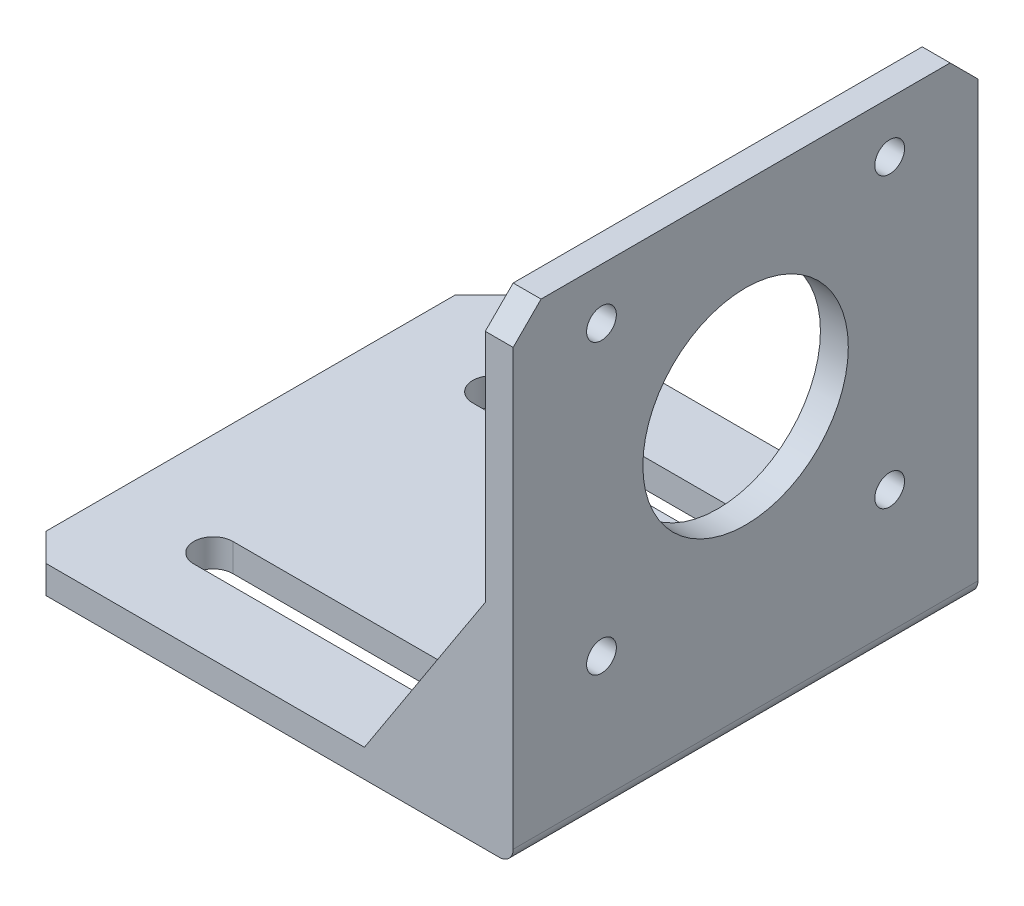
ISO-10303-21;
HEADER;
FILE_DESCRIPTION(('STEP AP214'),'2;1');
FILE_NAME('part.step','',(''),(''),'','','');
FILE_SCHEMA(('AUTOMOTIVE_DESIGN { 1 0 10303 214 1 1 1 1 }'));
ENDSEC;
DATA;
#1=APPLICATION_CONTEXT('core data for automotive mechanical design processes');
#2=APPLICATION_PROTOCOL_DEFINITION('international standard','automotive_design',2000,#1);
#3=PRODUCT_CONTEXT('',#1,'mechanical');
#4=PRODUCT('Part','Part','',(#3));
#5=PRODUCT_RELATED_PRODUCT_CATEGORY('part','',(#4));
#6=PRODUCT_DEFINITION_FORMATION('','',#4);
#7=PRODUCT_DEFINITION_CONTEXT('part definition',#1,'design');
#8=PRODUCT_DEFINITION('design','',#6,#7);
#9=PRODUCT_DEFINITION_SHAPE('','',#8);
#10=(LENGTH_UNIT() NAMED_UNIT(*) SI_UNIT(.MILLI.,.METRE.));
#11=(NAMED_UNIT(*) PLANE_ANGLE_UNIT() SI_UNIT($,.RADIAN.));
#12=(NAMED_UNIT(*) SI_UNIT($,.STERADIAN.) SOLID_ANGLE_UNIT());
#13=UNCERTAINTY_MEASURE_WITH_UNIT(LENGTH_MEASURE(1.E-05),#10,'distance_accuracy_value','');
#14=(GEOMETRIC_REPRESENTATION_CONTEXT(3) GLOBAL_UNCERTAINTY_ASSIGNED_CONTEXT((#13)) GLOBAL_UNIT_ASSIGNED_CONTEXT((#10,
#11,#12)) REPRESENTATION_CONTEXT('',''));
#15=CARTESIAN_POINT('',(0.,0.,0.));
#16=DIRECTION('',(0.,0.,1.));
#17=DIRECTION('',(1.,0.,0.));
#18=AXIS2_PLACEMENT_3D('',#15,#16,#17);
#19=CARTESIAN_POINT('',(0.,-3.,50.));
#20=DIRECTION('',(1.,0.,0.));
#21=DIRECTION('',(0.,0.,-1.));
#22=AXIS2_PLACEMENT_3D('',#19,#20,#21);
#23=PLANE('',#22);
#24=DIRECTION('',(0.,0.,-1.));
#25=VECTOR('',#24,1.);
#26=CARTESIAN_POINT('',(0.,0.,50.));
#27=LINE('',#26,#25);
#28=CARTESIAN_POINT('',(0.,0.,47.));
#29=VERTEX_POINT('',#28);
#30=CARTESIAN_POINT('',(0.,0.,3.00000000000002));
#31=VERTEX_POINT('',#30);
#32=EDGE_CURVE('E455',#29,#31,#27,.T.);
#33=ORIENTED_EDGE('',*,*,#32,.T.);
#34=DIRECTION('',(0.,-1.,0.));
#35=VECTOR('',#34,1.);
#36=CARTESIAN_POINT('',(0.,-3.,3.00000000000002));
#37=LINE('',#36,#35);
#38=CARTESIAN_POINT('',(0.,-3.,3.00000000000002));
#39=VERTEX_POINT('',#38);
#40=EDGE_CURVE('E505',#31,#39,#37,.T.);
#41=ORIENTED_EDGE('',*,*,#40,.T.);
#42=DIRECTION('',(0.,0.,-1.));
#43=VECTOR('',#42,1.);
#44=CARTESIAN_POINT('',(0.,-3.,50.));
#45=LINE('',#44,#43);
#46=CARTESIAN_POINT('',(0.,-3.,47.));
#47=VERTEX_POINT('',#46);
#48=EDGE_CURVE('E472',#47,#39,#45,.T.);
#49=ORIENTED_EDGE('',*,*,#48,.F.);
#50=DIRECTION('',(0.,1.,0.));
#51=VECTOR('',#50,1.);
#52=CARTESIAN_POINT('',(0.,-3.,47.));
#53=LINE('',#52,#51);
#54=EDGE_CURVE('E503',#47,#29,#53,.T.);
#55=ORIENTED_EDGE('',*,*,#54,.T.);
#56=EDGE_LOOP('',(#33,#41,#49,#55));
#57=FACE_BOUND('',#56,.T.);
#58=ADVANCED_FACE('F189',(#57),#23,.F.);
#59=CARTESIAN_POINT('',(53.25,-2.99999999999999,50.));
#60=DIRECTION('',(0.,1.,0.));
#61=DIRECTION('',(-1.,0.,0.));
#62=AXIS2_PLACEMENT_3D('',#59,#60,#61);
#63=PLANE('',#62);
#64=DIRECTION('',(1.,0.,0.));
#65=VECTOR('',#64,1.);
#66=CARTESIAN_POINT('',(53.25,-2.99999999999999,0.));
#67=LINE('',#66,#65);
#68=CARTESIAN_POINT('',(3.00000000000002,-3.,0.));
#69=VERTEX_POINT('',#68);
#70=CARTESIAN_POINT('',(51.75,-2.99999999999999,0.));
#71=VERTEX_POINT('',#70);
#72=EDGE_CURVE('E449',#69,#71,#67,.T.);
#73=ORIENTED_EDGE('',*,*,#72,.T.);
#74=DIRECTION('',(0.,0.,-1.));
#75=VECTOR('',#74,1.);
#76=CARTESIAN_POINT('',(51.75,-2.99999999999999,50.));
#77=LINE('',#76,#75);
#78=CARTESIAN_POINT('',(51.75,-2.99999999999999,50.));
#79=VERTEX_POINT('',#78);
#80=EDGE_CURVE('E544',#71,#79,#77,.F.);
#81=ORIENTED_EDGE('',*,*,#80,.T.);
#82=DIRECTION('',(1.,0.,0.));
#83=VECTOR('',#82,1.);
#84=CARTESIAN_POINT('',(53.25,-2.99999999999999,50.));
#85=LINE('',#84,#83);
#86=CARTESIAN_POINT('',(3.00000000000002,-3.,50.));
#87=VERTEX_POINT('',#86);
#88=EDGE_CURVE('E450',#87,#79,#85,.T.);
#89=ORIENTED_EDGE('',*,*,#88,.F.);
#90=DIRECTION('',(0.707106781186548,0.,0.707106781186548));
#91=VECTOR('',#90,1.);
#92=CARTESIAN_POINT('',(3.00000000000002,-3.,50.));
#93=LINE('',#92,#91);
#94=EDGE_CURVE('E508',#87,#47,#93,.F.);
#95=ORIENTED_EDGE('',*,*,#94,.T.);
#96=ORIENTED_EDGE('',*,*,#48,.T.);
#97=DIRECTION('',(0.707106781186548,0.,-0.707106781186548));
#98=VECTOR('',#97,1.);
#99=CARTESIAN_POINT('',(0.,-3.,3.00000000000002));
#100=LINE('',#99,#98);
#101=EDGE_CURVE('E510',#39,#69,#100,.T.);
#102=ORIENTED_EDGE('',*,*,#101,.T.);
#103=EDGE_LOOP('',(#73,#81,#89,#95,#96,#102));
#104=FACE_BOUND('',#103,.T.);
#105=CARTESIAN_POINT('',(41.,-2.99999999999999,10.));
#106=DIRECTION('',(0.,1.,0.));
#107=DIRECTION('',(-1.,0.,0.));
#108=AXIS2_PLACEMENT_3D('',#105,#106,#107);
#109=CIRCLE('',#108,2.1);
#110=CARTESIAN_POINT('',(41.,-2.99999999999999,12.1));
#111=VERTEX_POINT('',#110);
#112=CARTESIAN_POINT('',(41.,-3.,7.9));
#113=VERTEX_POINT('',#112);
#114=EDGE_CURVE('E493',#111,#113,#109,.T.);
#115=ORIENTED_EDGE('',*,*,#114,.T.);
#116=DIRECTION('',(-1.,0.,0.));
#117=VECTOR('',#116,1.);
#118=CARTESIAN_POINT('',(53.25,-2.99999999999999,7.9));
#119=LINE('',#118,#117);
#120=CARTESIAN_POINT('',(11.,-3.,7.9));
#121=VERTEX_POINT('',#120);
#122=EDGE_CURVE('E496',#113,#121,#119,.T.);
#123=ORIENTED_EDGE('',*,*,#122,.T.);
#124=CARTESIAN_POINT('',(11.,-3.,10.));
#125=DIRECTION('',(0.,1.,0.));
#126=DIRECTION('',(-1.,0.,0.));
#127=AXIS2_PLACEMENT_3D('',#124,#125,#126);
#128=CIRCLE('',#127,2.1);
#129=CARTESIAN_POINT('',(11.,-3.,12.1));
#130=VERTEX_POINT('',#129);
#131=EDGE_CURVE('E490',#121,#130,#128,.T.);
#132=ORIENTED_EDGE('',*,*,#131,.T.);
#133=DIRECTION('',(1.,0.,0.));
#134=VECTOR('',#133,1.);
#135=CARTESIAN_POINT('',(53.25,-2.99999999999999,12.1));
#136=LINE('',#135,#134);
#137=EDGE_CURVE('E487',#130,#111,#136,.T.);
#138=ORIENTED_EDGE('',*,*,#137,.T.);
#139=EDGE_LOOP('',(#115,#123,#132,#138));
#140=FACE_BOUND('',#139,.T.);
#141=CARTESIAN_POINT('',(41.,-2.99999999999999,40.));
#142=DIRECTION('',(0.,1.,0.));
#143=DIRECTION('',(-1.,0.,0.));
#144=AXIS2_PLACEMENT_3D('',#141,#142,#143);
#145=CIRCLE('',#144,2.1);
#146=CARTESIAN_POINT('',(41.,-3.,42.1));
#147=VERTEX_POINT('',#146);
#148=CARTESIAN_POINT('',(41.,-3.,37.9));
#149=VERTEX_POINT('',#148);
#150=EDGE_CURVE('E481',#147,#149,#145,.T.);
#151=ORIENTED_EDGE('',*,*,#150,.T.);
#152=DIRECTION('',(-1.,0.,0.));
#153=VECTOR('',#152,1.);
#154=CARTESIAN_POINT('',(53.25,-2.99999999999999,37.9));
#155=LINE('',#154,#153);
#156=CARTESIAN_POINT('',(11.,-3.,37.9));
#157=VERTEX_POINT('',#156);
#158=EDGE_CURVE('E484',#149,#157,#155,.T.);
#159=ORIENTED_EDGE('',*,*,#158,.T.);
#160=CARTESIAN_POINT('',(11.,-3.,40.));
#161=DIRECTION('',(0.,1.,0.));
#162=DIRECTION('',(-1.,0.,0.));
#163=AXIS2_PLACEMENT_3D('',#160,#161,#162);
#164=CIRCLE('',#163,2.1);
#165=CARTESIAN_POINT('',(11.,-3.,42.1));
#166=VERTEX_POINT('',#165);
#167=EDGE_CURVE('E478',#157,#166,#164,.T.);
#168=ORIENTED_EDGE('',*,*,#167,.T.);
#169=DIRECTION('',(1.,0.,0.));
#170=VECTOR('',#169,1.);
#171=CARTESIAN_POINT('',(53.25,-2.99999999999999,42.1));
#172=LINE('',#171,#170);
#173=EDGE_CURVE('E475',#166,#147,#172,.T.);
#174=ORIENTED_EDGE('',*,*,#173,.T.);
#175=EDGE_LOOP('',(#151,#159,#168,#174));
#176=FACE_BOUND('',#175,.T.);
#177=ADVANCED_FACE('F585',(#104,#140,#176),#63,.F.);
#178=CARTESIAN_POINT('',(53.25,48.25,50.));
#179=DIRECTION('',(-1.,0.,0.));
#180=DIRECTION('',(0.,-1.,0.));
#181=AXIS2_PLACEMENT_3D('',#178,#179,#180);
#182=PLANE('',#181);
#183=DIRECTION('',(0.,1.,0.));
#184=VECTOR('',#183,1.);
#185=CARTESIAN_POINT('',(53.25,48.25,50.));
#186=LINE('',#185,#184);
#187=CARTESIAN_POINT('',(53.25,-1.49999999999998,50.));
#188=VERTEX_POINT('',#187);
#189=CARTESIAN_POINT('',(53.25,45.25,50.));
#190=VERTEX_POINT('',#189);
#191=EDGE_CURVE('E360',#188,#190,#186,.T.);
#192=ORIENTED_EDGE('',*,*,#191,.F.);
#193=DIRECTION('',(0.,0.,-1.));
#194=VECTOR('',#193,1.);
#195=CARTESIAN_POINT('',(53.25,-1.49999999999999,50.));
#196=LINE('',#195,#194);
#197=CARTESIAN_POINT('',(53.25,-1.49999999999998,0.));
#198=VERTEX_POINT('',#197);
#199=EDGE_CURVE('E539',#188,#198,#196,.T.);
#200=ORIENTED_EDGE('',*,*,#199,.T.);
#201=DIRECTION('',(0.,1.,0.));
#202=VECTOR('',#201,1.);
#203=CARTESIAN_POINT('',(53.25,48.25,0.));
#204=LINE('',#203,#202);
#205=CARTESIAN_POINT('',(53.25,45.25,0.));
#206=VERTEX_POINT('',#205);
#207=EDGE_CURVE('E458',#198,#206,#204,.T.);
#208=ORIENTED_EDGE('',*,*,#207,.T.);
#209=DIRECTION('',(0.,0.707106781186548,0.707106781186548));
#210=VECTOR('',#209,1.);
#211=CARTESIAN_POINT('',(53.25,48.25,3.00000000000002));
#212=LINE('',#211,#210);
#213=CARTESIAN_POINT('',(53.25,48.25,3.00000000000002));
#214=VERTEX_POINT('',#213);
#215=EDGE_CURVE('E537',#206,#214,#212,.T.);
#216=ORIENTED_EDGE('',*,*,#215,.T.);
#217=DIRECTION('',(0.,0.,-1.));
#218=VECTOR('',#217,1.);
#219=CARTESIAN_POINT('',(53.25,48.25,50.));
#220=LINE('',#219,#218);
#221=CARTESIAN_POINT('',(53.25,48.25,47.));
#222=VERTEX_POINT('',#221);
#223=EDGE_CURVE('E469',#222,#214,#220,.T.);
#224=ORIENTED_EDGE('',*,*,#223,.F.);
#225=DIRECTION('',(0.,0.707106781186546,-0.707106781186549));
#226=VECTOR('',#225,1.);
#227=CARTESIAN_POINT('',(53.25,45.25,50.));
#228=LINE('',#227,#226);
#229=EDGE_CURVE('E534',#222,#190,#228,.F.);
#230=ORIENTED_EDGE('',*,*,#229,.T.);
#231=EDGE_LOOP('',(#192,#200,#208,#216,#224,#230));
#232=FACE_BOUND('',#231,.T.);
#233=CARTESIAN_POINT('',(53.25,42.75,9.5));
#234=DIRECTION('',(-1.,0.,0.));
#235=DIRECTION('',(0.,-1.,0.));
#236=AXIS2_PLACEMENT_3D('',#233,#234,#235);
#237=CIRCLE('',#236,1.60000000000001);
#238=CARTESIAN_POINT('',(53.25,41.15,9.5));
#239=VERTEX_POINT('',#238);
#240=EDGE_CURVE('E422',#239,#239,#237,.T.);
#241=ORIENTED_EDGE('',*,*,#240,.T.);
#242=EDGE_LOOP('',(#241));
#243=FACE_BOUND('',#242,.T.);
#244=CARTESIAN_POINT('',(53.25,42.75,40.5));
#245=DIRECTION('',(-1.,0.,0.));
#246=DIRECTION('',(0.,-1.,0.));
#247=AXIS2_PLACEMENT_3D('',#244,#245,#246);
#248=CIRCLE('',#247,1.60000000000001);
#249=CARTESIAN_POINT('',(53.25,41.15,40.5));
#250=VERTEX_POINT('',#249);
#251=EDGE_CURVE('E428',#250,#250,#248,.T.);
#252=ORIENTED_EDGE('',*,*,#251,.T.);
#253=EDGE_LOOP('',(#252));
#254=FACE_BOUND('',#253,.T.);
#255=CARTESIAN_POINT('',(53.25,11.75,40.5));
#256=DIRECTION('',(-1.,0.,0.));
#257=DIRECTION('',(0.,-1.,0.));
#258=AXIS2_PLACEMENT_3D('',#255,#256,#257);
#259=CIRCLE('',#258,1.60000000000001);
#260=CARTESIAN_POINT('',(53.25,10.15,40.5));
#261=VERTEX_POINT('',#260);
#262=EDGE_CURVE('E434',#261,#261,#259,.T.);
#263=ORIENTED_EDGE('',*,*,#262,.T.);
#264=EDGE_LOOP('',(#263));
#265=FACE_BOUND('',#264,.T.);
#266=CARTESIAN_POINT('',(53.25,11.75,9.50000000000001));
#267=DIRECTION('',(-1.,0.,0.));
#268=DIRECTION('',(0.,-1.,0.));
#269=AXIS2_PLACEMENT_3D('',#266,#267,#268);
#270=CIRCLE('',#269,1.60000000000001);
#271=CARTESIAN_POINT('',(53.25,10.15,9.50000000000001));
#272=VERTEX_POINT('',#271);
#273=EDGE_CURVE('E440',#272,#272,#270,.T.);
#274=ORIENTED_EDGE('',*,*,#273,.T.);
#275=EDGE_LOOP('',(#274));
#276=FACE_BOUND('',#275,.T.);
#277=CARTESIAN_POINT('',(53.25,27.25,25.));
#278=DIRECTION('',(-1.,0.,0.));
#279=DIRECTION('',(0.,-1.,0.));
#280=AXIS2_PLACEMENT_3D('',#277,#278,#279);
#281=CIRCLE('',#280,11.05);
#282=CARTESIAN_POINT('',(53.25,16.2,25.));
#283=VERTEX_POINT('',#282);
#284=EDGE_CURVE('E446',#283,#283,#281,.T.);
#285=ORIENTED_EDGE('',*,*,#284,.T.);
#286=EDGE_LOOP('',(#285));
#287=FACE_BOUND('',#286,.T.);
#288=ADVANCED_FACE('F605',(#232,#243,#254,#265,#276,#287),#182,.F.);
#289=CARTESIAN_POINT('',(50.25,48.25,50.));
#290=DIRECTION('',(0.,-1.,0.));
#291=DIRECTION('',(0.,0.,-1.));
#292=AXIS2_PLACEMENT_3D('',#289,#290,#291);
#293=PLANE('',#292);
#294=ORIENTED_EDGE('',*,*,#223,.T.);
#295=DIRECTION('',(-1.,0.,0.));
#296=VECTOR('',#295,1.);
#297=CARTESIAN_POINT('',(50.25,48.25,3.00000000000002));
#298=LINE('',#297,#296);
#299=CARTESIAN_POINT('',(50.25,48.25,3.00000000000002));
#300=VERTEX_POINT('',#299);
#301=EDGE_CURVE('E527',#214,#300,#298,.T.);
#302=ORIENTED_EDGE('',*,*,#301,.T.);
#303=DIRECTION('',(0.,0.,-1.));
#304=VECTOR('',#303,1.);
#305=CARTESIAN_POINT('',(50.25,48.25,50.));
#306=LINE('',#305,#304);
#307=CARTESIAN_POINT('',(50.25,48.25,47.));
#308=VERTEX_POINT('',#307);
#309=EDGE_CURVE('E466',#308,#300,#306,.T.);
#310=ORIENTED_EDGE('',*,*,#309,.F.);
#311=DIRECTION('',(1.,0.,0.));
#312=VECTOR('',#311,1.);
#313=CARTESIAN_POINT('',(50.25,48.25,47.));
#314=LINE('',#313,#312);
#315=EDGE_CURVE('E525',#308,#222,#314,.T.);
#316=ORIENTED_EDGE('',*,*,#315,.T.);
#317=EDGE_LOOP('',(#294,#302,#310,#316));
#318=FACE_BOUND('',#317,.T.);
#319=ADVANCED_FACE('F614',(#318),#293,.F.);
#320=CARTESIAN_POINT('',(50.25,0.,50.));
#321=DIRECTION('',(1.,0.,0.));
#322=DIRECTION('',(0.,0.,-1.));
#323=AXIS2_PLACEMENT_3D('',#320,#321,#322);
#324=PLANE('',#323);
#325=CARTESIAN_POINT('',(50.25,42.75,9.5));
#326=DIRECTION('',(-1.,0.,0.));
#327=DIRECTION('',(0.,0.,1.));
#328=AXIS2_PLACEMENT_3D('',#325,#326,#327);
#329=CIRCLE('',#328,1.60000000000002);
#330=CARTESIAN_POINT('',(50.25,42.75,11.1));
#331=VERTEX_POINT('',#330);
#332=EDGE_CURVE('E419',#331,#331,#329,.T.);
#333=ORIENTED_EDGE('',*,*,#332,.F.);
#334=EDGE_LOOP('',(#333));
#335=FACE_BOUND('',#334,.T.);
#336=CARTESIAN_POINT('',(50.25,42.75,40.5));
#337=DIRECTION('',(-1.,0.,0.));
#338=DIRECTION('',(0.,0.,1.));
#339=AXIS2_PLACEMENT_3D('',#336,#337,#338);
#340=CIRCLE('',#339,1.60000000000002);
#341=CARTESIAN_POINT('',(50.25,42.75,42.1));
#342=VERTEX_POINT('',#341);
#343=EDGE_CURVE('E425',#342,#342,#340,.T.);
#344=ORIENTED_EDGE('',*,*,#343,.F.);
#345=EDGE_LOOP('',(#344));
#346=FACE_BOUND('',#345,.T.);
#347=CARTESIAN_POINT('',(50.25,11.75,40.5));
#348=DIRECTION('',(-1.,0.,0.));
#349=DIRECTION('',(0.,0.,1.));
#350=AXIS2_PLACEMENT_3D('',#347,#348,#349);
#351=CIRCLE('',#350,1.60000000000001);
#352=CARTESIAN_POINT('',(50.25,11.75,42.1));
#353=VERTEX_POINT('',#352);
#354=EDGE_CURVE('E431',#353,#353,#351,.T.);
#355=ORIENTED_EDGE('',*,*,#354,.F.);
#356=EDGE_LOOP('',(#355));
#357=FACE_BOUND('',#356,.T.);
#358=CARTESIAN_POINT('',(50.25,11.75,9.50000000000001));
#359=DIRECTION('',(-1.,0.,0.));
#360=DIRECTION('',(0.,0.,1.));
#361=AXIS2_PLACEMENT_3D('',#358,#359,#360);
#362=CIRCLE('',#361,1.60000000000001);
#363=CARTESIAN_POINT('',(50.25,11.75,11.1));
#364=VERTEX_POINT('',#363);
#365=EDGE_CURVE('E437',#364,#364,#362,.T.);
#366=ORIENTED_EDGE('',*,*,#365,.F.);
#367=EDGE_LOOP('',(#366));
#368=FACE_BOUND('',#367,.T.);
#369=CARTESIAN_POINT('',(50.25,27.25,25.));
#370=DIRECTION('',(-1.,0.,0.));
#371=DIRECTION('',(0.,0.,1.));
#372=AXIS2_PLACEMENT_3D('',#369,#370,#371);
#373=CIRCLE('',#372,11.05);
#374=CARTESIAN_POINT('',(50.25,27.25,36.05));
#375=VERTEX_POINT('',#374);
#376=EDGE_CURVE('E443',#375,#375,#373,.T.);
#377=ORIENTED_EDGE('',*,*,#376,.F.);
#378=EDGE_LOOP('',(#377));
#379=FACE_BOUND('',#378,.T.);
#380=DIRECTION('',(0.,1.,0.));
#381=VECTOR('',#380,1.);
#382=CARTESIAN_POINT('',(50.25,0.,2.1));
#383=LINE('',#382,#381);
#384=CARTESIAN_POINT('',(50.25,1.5,2.1));
#385=VERTEX_POINT('',#384);
#386=CARTESIAN_POINT('',(50.25,20.,2.1));
#387=VERTEX_POINT('',#386);
#388=EDGE_CURVE('E562',#385,#387,#383,.T.);
#389=ORIENTED_EDGE('',*,*,#388,.F.);
#390=DIRECTION('',(0.,0.,-1.));
#391=VECTOR('',#390,1.);
#392=CARTESIAN_POINT('',(50.25,1.5,47.9));
#393=LINE('',#392,#391);
#394=CARTESIAN_POINT('',(50.25,1.5,47.9));
#395=VERTEX_POINT('',#394);
#396=EDGE_CURVE('E197',#385,#395,#393,.F.);
#397=ORIENTED_EDGE('',*,*,#396,.T.);
#398=DIRECTION('',(0.,-1.,0.));
#399=VECTOR('',#398,1.);
#400=CARTESIAN_POINT('',(50.25,0.,47.9));
#401=LINE('',#400,#399);
#402=CARTESIAN_POINT('',(50.25,20.,47.9));
#403=VERTEX_POINT('',#402);
#404=EDGE_CURVE('E373',#403,#395,#401,.T.);
#405=ORIENTED_EDGE('',*,*,#404,.F.);
#406=DIRECTION('',(0.,0.,1.));
#407=VECTOR('',#406,1.);
#408=CARTESIAN_POINT('',(50.25,20.,50.));
#409=LINE('',#408,#407);
#410=CARTESIAN_POINT('',(50.25,20.,50.));
#411=VERTEX_POINT('',#410);
#412=EDGE_CURVE('E365',#403,#411,#409,.T.);
#413=ORIENTED_EDGE('',*,*,#412,.T.);
#414=DIRECTION('',(0.,-1.,0.));
#415=VECTOR('',#414,1.);
#416=CARTESIAN_POINT('',(50.25,0.,50.));
#417=LINE('',#416,#415);
#418=CARTESIAN_POINT('',(50.25,45.25,50.));
#419=VERTEX_POINT('',#418);
#420=EDGE_CURVE('E349',#419,#411,#417,.T.);
#421=ORIENTED_EDGE('',*,*,#420,.F.);
#422=DIRECTION('',(0.,-0.707106781186546,0.707106781186549));
#423=VECTOR('',#422,1.);
#424=CARTESIAN_POINT('',(50.25,45.25,50.));
#425=LINE('',#424,#423);
#426=EDGE_CURVE('E530',#419,#308,#425,.F.);
#427=ORIENTED_EDGE('',*,*,#426,.T.);
#428=ORIENTED_EDGE('',*,*,#309,.T.);
#429=DIRECTION('',(0.,-0.707106781186548,-0.707106781186548));
#430=VECTOR('',#429,1.);
#431=CARTESIAN_POINT('',(50.25,48.25,3.00000000000002));
#432=LINE('',#431,#430);
#433=CARTESIAN_POINT('',(50.25,45.25,0.));
#434=VERTEX_POINT('',#433);
#435=EDGE_CURVE('E532',#300,#434,#432,.T.);
#436=ORIENTED_EDGE('',*,*,#435,.T.);
#437=DIRECTION('',(0.,-1.,0.));
#438=VECTOR('',#437,1.);
#439=CARTESIAN_POINT('',(50.25,0.,0.));
#440=LINE('',#439,#438);
#441=CARTESIAN_POINT('',(50.25,20.,0.));
#442=VERTEX_POINT('',#441);
#443=EDGE_CURVE('E460',#434,#442,#440,.T.);
#444=ORIENTED_EDGE('',*,*,#443,.T.);
#445=DIRECTION('',(0.,0.,-1.));
#446=VECTOR('',#445,1.);
#447=CARTESIAN_POINT('',(50.25,20.,50.));
#448=LINE('',#447,#446);
#449=EDGE_CURVE('E573',#442,#387,#448,.F.);
#450=ORIENTED_EDGE('',*,*,#449,.T.);
#451=EDGE_LOOP('',(#389,#397,#405,#413,#421,#427,#428,#436,#444,#450));
#452=FACE_BOUND('',#451,.T.);
#453=ADVANCED_FACE('F372',(#335,#346,#357,#368,#379,#452),#324,.F.);
#454=CARTESIAN_POINT('',(0.,0.,50.));
#455=DIRECTION('',(0.,-1.,0.));
#456=DIRECTION('',(0.,0.,-1.));
#457=AXIS2_PLACEMENT_3D('',#454,#455,#456);
#458=PLANE('',#457);
#459=CARTESIAN_POINT('',(41.,0.,10.));
#460=DIRECTION('',(0.,1.,0.));
#461=DIRECTION('',(0.,0.,1.));
#462=AXIS2_PLACEMENT_3D('',#459,#460,#461);
#463=CIRCLE('',#462,2.1);
#464=CARTESIAN_POINT('',(41.,0.,12.1));
#465=VERTEX_POINT('',#464);
#466=CARTESIAN_POINT('',(41.,0.,7.9));
#467=VERTEX_POINT('',#466);
#468=EDGE_CURVE('E392',#465,#467,#463,.T.);
#469=ORIENTED_EDGE('',*,*,#468,.F.);
#470=DIRECTION('',(1.,0.,0.));
#471=VECTOR('',#470,1.);
#472=CARTESIAN_POINT('',(11.,0.,12.1));
#473=LINE('',#472,#471);
#474=CARTESIAN_POINT('',(11.,0.,12.1));
#475=VERTEX_POINT('',#474);
#476=EDGE_CURVE('E375',#475,#465,#473,.T.);
#477=ORIENTED_EDGE('',*,*,#476,.F.);
#478=CARTESIAN_POINT('',(11.,0.,10.));
#479=DIRECTION('',(0.,1.,0.));
#480=DIRECTION('',(0.,0.,1.));
#481=AXIS2_PLACEMENT_3D('',#478,#479,#480);
#482=CIRCLE('',#481,2.1);
#483=CARTESIAN_POINT('',(11.,0.,7.9));
#484=VERTEX_POINT('',#483);
#485=EDGE_CURVE('E384',#484,#475,#482,.T.);
#486=ORIENTED_EDGE('',*,*,#485,.F.);
#487=DIRECTION('',(1.,0.,0.));
#488=VECTOR('',#487,1.);
#489=CARTESIAN_POINT('',(11.,0.,7.9));
#490=LINE('',#489,#488);
#491=EDGE_CURVE('E381',#484,#467,#490,.T.);
#492=ORIENTED_EDGE('',*,*,#491,.T.);
#493=EDGE_LOOP('',(#469,#477,#486,#492));
#494=FACE_BOUND('',#493,.T.);
#495=CARTESIAN_POINT('',(41.,0.,40.));
#496=DIRECTION('',(0.,1.,0.));
#497=DIRECTION('',(0.,0.,1.));
#498=AXIS2_PLACEMENT_3D('',#495,#496,#497);
#499=CIRCLE('',#498,2.1);
#500=CARTESIAN_POINT('',(41.,0.,42.1));
#501=VERTEX_POINT('',#500);
#502=CARTESIAN_POINT('',(41.,0.,37.9));
#503=VERTEX_POINT('',#502);
#504=EDGE_CURVE('E411',#501,#503,#499,.T.);
#505=ORIENTED_EDGE('',*,*,#504,.F.);
#506=DIRECTION('',(1.,0.,0.));
#507=VECTOR('',#506,1.);
#508=CARTESIAN_POINT('',(11.,0.,42.1));
#509=LINE('',#508,#507);
#510=CARTESIAN_POINT('',(11.,0.,42.1));
#511=VERTEX_POINT('',#510);
#512=EDGE_CURVE('E399',#511,#501,#509,.T.);
#513=ORIENTED_EDGE('',*,*,#512,.F.);
#514=CARTESIAN_POINT('',(11.,0.,40.));
#515=DIRECTION('',(0.,1.,0.));
#516=DIRECTION('',(0.,0.,1.));
#517=AXIS2_PLACEMENT_3D('',#514,#515,#516);
#518=CIRCLE('',#517,2.1);
#519=CARTESIAN_POINT('',(11.,0.,37.9));
#520=VERTEX_POINT('',#519);
#521=EDGE_CURVE('E404',#520,#511,#518,.T.);
#522=ORIENTED_EDGE('',*,*,#521,.F.);
#523=DIRECTION('',(1.,0.,0.));
#524=VECTOR('',#523,1.);
#525=CARTESIAN_POINT('',(11.,0.,37.9));
#526=LINE('',#525,#524);
#527=EDGE_CURVE('E401',#520,#503,#526,.T.);
#528=ORIENTED_EDGE('',*,*,#527,.T.);
#529=EDGE_LOOP('',(#505,#513,#522,#528));
#530=FACE_BOUND('',#529,.T.);
#531=DIRECTION('',(-1.,0.,0.));
#532=VECTOR('',#531,1.);
#533=CARTESIAN_POINT('',(0.,0.,47.9));
#534=LINE('',#533,#532);
#535=CARTESIAN_POINT('',(48.75,0.,47.9));
#536=VERTEX_POINT('',#535);
#537=CARTESIAN_POINT('',(37.25,0.,47.9));
#538=VERTEX_POINT('',#537);
#539=EDGE_CURVE('E499',#536,#538,#534,.T.);
#540=ORIENTED_EDGE('',*,*,#539,.F.);
#541=DIRECTION('',(0.,0.,-1.));
#542=VECTOR('',#541,1.);
#543=CARTESIAN_POINT('',(48.75,0.,2.1));
#544=LINE('',#543,#542);
#545=CARTESIAN_POINT('',(48.75,0.,2.1));
#546=VERTEX_POINT('',#545);
#547=EDGE_CURVE('E548',#536,#546,#544,.T.);
#548=ORIENTED_EDGE('',*,*,#547,.T.);
#549=DIRECTION('',(1.,0.,0.));
#550=VECTOR('',#549,1.);
#551=CARTESIAN_POINT('',(0.,0.,2.1));
#552=LINE('',#551,#550);
#553=CARTESIAN_POINT('',(37.25,0.,2.1));
#554=VERTEX_POINT('',#553);
#555=EDGE_CURVE('E501',#554,#546,#552,.T.);
#556=ORIENTED_EDGE('',*,*,#555,.F.);
#557=DIRECTION('',(0.,0.,1.));
#558=VECTOR('',#557,1.);
#559=CARTESIAN_POINT('',(37.25,0.,50.));
#560=LINE('',#559,#558);
#561=CARTESIAN_POINT('',(37.25,0.,0.));
#562=VERTEX_POINT('',#561);
#563=EDGE_CURVE('E569',#554,#562,#560,.F.);
#564=ORIENTED_EDGE('',*,*,#563,.T.);
#565=DIRECTION('',(-1.,0.,0.));
#566=VECTOR('',#565,1.);
#567=CARTESIAN_POINT('',(0.,0.,0.));
#568=LINE('',#567,#566);
#569=CARTESIAN_POINT('',(3.00000000000002,0.,0.));
#570=VERTEX_POINT('',#569);
#571=EDGE_CURVE('E452',#562,#570,#568,.T.);
#572=ORIENTED_EDGE('',*,*,#571,.T.);
#573=DIRECTION('',(-0.707106781186548,0.,0.707106781186548));
#574=VECTOR('',#573,1.);
#575=CARTESIAN_POINT('',(0.,0.,3.00000000000002));
#576=LINE('',#575,#574);
#577=EDGE_CURVE('E519',#570,#31,#576,.T.);
#578=ORIENTED_EDGE('',*,*,#577,.T.);
#579=ORIENTED_EDGE('',*,*,#32,.F.);
#580=DIRECTION('',(-0.707106781186548,0.,-0.707106781186548));
#581=VECTOR('',#580,1.);
#582=CARTESIAN_POINT('',(3.00000000000002,0.,50.));
#583=LINE('',#582,#581);
#584=CARTESIAN_POINT('',(3.00000000000002,0.,50.));
#585=VERTEX_POINT('',#584);
#586=EDGE_CURVE('E517',#29,#585,#583,.F.);
#587=ORIENTED_EDGE('',*,*,#586,.T.);
#588=DIRECTION('',(-1.,0.,0.));
#589=VECTOR('',#588,1.);
#590=CARTESIAN_POINT('',(0.,0.,50.));
#591=LINE('',#590,#589);
#592=CARTESIAN_POINT('',(37.25,0.,50.));
#593=VERTEX_POINT('',#592);
#594=EDGE_CURVE('E359',#593,#585,#591,.T.);
#595=ORIENTED_EDGE('',*,*,#594,.F.);
#596=DIRECTION('',(0.,0.,-1.));
#597=VECTOR('',#596,1.);
#598=CARTESIAN_POINT('',(37.25,0.,50.));
#599=LINE('',#598,#597);
#600=EDGE_CURVE('E368',#593,#538,#599,.T.);
#601=ORIENTED_EDGE('',*,*,#600,.T.);
#602=EDGE_LOOP('',(#540,#548,#556,#564,#572,#578,#579,#587,#595,#601));
#603=FACE_BOUND('',#602,.T.);
#604=ADVANCED_FACE('F554',(#494,#530,#603),#458,.F.);
#605=CARTESIAN_POINT('',(0.,0.,50.));
#606=DIRECTION('',(0.,0.,-1.));
#607=DIRECTION('',(-1.,0.,0.));
#608=AXIS2_PLACEMENT_3D('',#605,#606,#607);
#609=PLANE('',#608);
#610=ORIENTED_EDGE('',*,*,#88,.T.);
#611=CARTESIAN_POINT('',(51.75,-1.49999999999999,50.));
#612=DIRECTION('',(0.,0.,-1.));
#613=DIRECTION('',(-1.,0.,0.));
#614=AXIS2_PLACEMENT_3D('',#611,#612,#613);
#615=CIRCLE('',#614,1.5);
#616=EDGE_CURVE('E546',#79,#188,#615,.F.);
#617=ORIENTED_EDGE('',*,*,#616,.T.);
#618=ORIENTED_EDGE('',*,*,#191,.T.);
#619=DIRECTION('',(-1.,0.,0.));
#620=VECTOR('',#619,1.);
#621=CARTESIAN_POINT('',(0.,45.25,50.));
#622=LINE('',#621,#620);
#623=EDGE_CURVE('E357',#190,#419,#622,.T.);
#624=ORIENTED_EDGE('',*,*,#623,.T.);
#625=ORIENTED_EDGE('',*,*,#420,.T.);
#626=DIRECTION('',(-0.544988350595414,-0.838443616300637,0.));
#627=VECTOR('',#626,1.);
#628=CARTESIAN_POINT('',(50.25,20.,50.));
#629=LINE('',#628,#627);
#630=EDGE_CURVE('E354',#411,#593,#629,.T.);
#631=ORIENTED_EDGE('',*,*,#630,.T.);
#632=ORIENTED_EDGE('',*,*,#594,.T.);
#633=DIRECTION('',(0.,-1.,0.));
#634=VECTOR('',#633,1.);
#635=CARTESIAN_POINT('',(3.00000000000002,0.,50.));
#636=LINE('',#635,#634);
#637=EDGE_CURVE('E522',#585,#87,#636,.T.);
#638=ORIENTED_EDGE('',*,*,#637,.T.);
#639=EDGE_LOOP('',(#610,#617,#618,#624,#625,#631,#632,#638));
#640=FACE_BOUND('',#639,.T.);
#641=ADVANCED_FACE('F352',(#640),#609,.F.);
#642=CARTESIAN_POINT('',(0.,0.,0.));
#643=DIRECTION('',(0.,0.,-1.));
#644=DIRECTION('',(-1.,0.,0.));
#645=AXIS2_PLACEMENT_3D('',#642,#643,#644);
#646=PLANE('',#645);
#647=ORIENTED_EDGE('',*,*,#207,.F.);
#648=CARTESIAN_POINT('',(51.75,-1.49999999999999,0.));
#649=DIRECTION('',(0.,0.,-1.));
#650=DIRECTION('',(-1.,0.,0.));
#651=AXIS2_PLACEMENT_3D('',#648,#649,#650);
#652=CIRCLE('',#651,1.5);
#653=EDGE_CURVE('E542',#198,#71,#652,.T.);
#654=ORIENTED_EDGE('',*,*,#653,.T.);
#655=ORIENTED_EDGE('',*,*,#72,.F.);
#656=DIRECTION('',(0.,1.,0.));
#657=VECTOR('',#656,1.);
#658=CARTESIAN_POINT('',(3.00000000000002,0.,0.));
#659=LINE('',#658,#657);
#660=EDGE_CURVE('E515',#69,#570,#659,.T.);
#661=ORIENTED_EDGE('',*,*,#660,.T.);
#662=ORIENTED_EDGE('',*,*,#571,.F.);
#663=DIRECTION('',(-0.544988350595414,-0.838443616300637,0.));
#664=VECTOR('',#663,1.);
#665=CARTESIAN_POINT('',(50.25,20.,0.));
#666=LINE('',#665,#664);
#667=EDGE_CURVE('E566',#442,#562,#666,.T.);
#668=ORIENTED_EDGE('',*,*,#667,.F.);
#669=ORIENTED_EDGE('',*,*,#443,.F.);
#670=DIRECTION('',(1.,0.,0.));
#671=VECTOR('',#670,1.);
#672=CARTESIAN_POINT('',(53.25,45.25,0.));
#673=LINE('',#672,#671);
#674=EDGE_CURVE('E512',#434,#206,#673,.T.);
#675=ORIENTED_EDGE('',*,*,#674,.T.);
#676=EDGE_LOOP('',(#647,#654,#655,#661,#662,#668,#669,#675));
#677=FACE_BOUND('',#676,.T.);
#678=ADVANCED_FACE('F597',(#677),#646,.T.);
#679=CARTESIAN_POINT('',(50.25,27.25,25.));
#680=DIRECTION('',(-1.,0.,0.));
#681=DIRECTION('',(0.,0.,1.));
#682=AXIS2_PLACEMENT_3D('',#679,#680,#681);
#683=CYLINDRICAL_SURFACE('',#682,11.05);
#684=ORIENTED_EDGE('',*,*,#376,.T.);
#685=EDGE_LOOP('',(#684));
#686=FACE_BOUND('',#685,.T.);
#687=ORIENTED_EDGE('',*,*,#284,.F.);
#688=EDGE_LOOP('',(#687));
#689=FACE_BOUND('',#688,.T.);
#690=ADVANCED_FACE('F727',(#686,#689),#683,.F.);
#691=CARTESIAN_POINT('',(50.25,11.75,9.50000000000001));
#692=DIRECTION('',(-1.,0.,0.));
#693=DIRECTION('',(0.,0.,1.));
#694=AXIS2_PLACEMENT_3D('',#691,#692,#693);
#695=CYLINDRICAL_SURFACE('',#694,1.60000000000001);
#696=ORIENTED_EDGE('',*,*,#365,.T.);
#697=EDGE_LOOP('',(#696));
#698=FACE_BOUND('',#697,.T.);
#699=ORIENTED_EDGE('',*,*,#273,.F.);
#700=EDGE_LOOP('',(#699));
#701=FACE_BOUND('',#700,.T.);
#702=ADVANCED_FACE('F916',(#698,#701),#695,.F.);
#703=CARTESIAN_POINT('',(50.25,11.75,40.5));
#704=DIRECTION('',(-1.,0.,0.));
#705=DIRECTION('',(0.,0.,1.));
#706=AXIS2_PLACEMENT_3D('',#703,#704,#705);
#707=CYLINDRICAL_SURFACE('',#706,1.60000000000001);
#708=ORIENTED_EDGE('',*,*,#354,.T.);
#709=EDGE_LOOP('',(#708));
#710=FACE_BOUND('',#709,.T.);
#711=ORIENTED_EDGE('',*,*,#262,.F.);
#712=EDGE_LOOP('',(#711));
#713=FACE_BOUND('',#712,.T.);
#714=ADVANCED_FACE('F905',(#710,#713),#707,.F.);
#715=CARTESIAN_POINT('',(50.25,42.75,40.5));
#716=DIRECTION('',(-1.,0.,0.));
#717=DIRECTION('',(0.,0.,1.));
#718=AXIS2_PLACEMENT_3D('',#715,#716,#717);
#719=CYLINDRICAL_SURFACE('',#718,1.60000000000001);
#720=ORIENTED_EDGE('',*,*,#343,.T.);
#721=EDGE_LOOP('',(#720));
#722=FACE_BOUND('',#721,.T.);
#723=ORIENTED_EDGE('',*,*,#251,.F.);
#724=EDGE_LOOP('',(#723));
#725=FACE_BOUND('',#724,.T.);
#726=ADVANCED_FACE('F894',(#722,#725),#719,.F.);
#727=CARTESIAN_POINT('',(50.25,42.75,9.5));
#728=DIRECTION('',(-1.,0.,0.));
#729=DIRECTION('',(0.,0.,1.));
#730=AXIS2_PLACEMENT_3D('',#727,#728,#729);
#731=CYLINDRICAL_SURFACE('',#730,1.60000000000001);
#732=ORIENTED_EDGE('',*,*,#332,.T.);
#733=EDGE_LOOP('',(#732));
#734=FACE_BOUND('',#733,.T.);
#735=ORIENTED_EDGE('',*,*,#240,.F.);
#736=EDGE_LOOP('',(#735));
#737=FACE_BOUND('',#736,.T.);
#738=ADVANCED_FACE('F883',(#734,#737),#731,.F.);
#739=CARTESIAN_POINT('',(41.,0.,40.));
#740=DIRECTION('',(0.,1.,0.));
#741=DIRECTION('',(0.,0.,1.));
#742=AXIS2_PLACEMENT_3D('',#739,#740,#741);
#743=CYLINDRICAL_SURFACE('',#742,2.1);
#744=DIRECTION('',(0.,1.,0.));
#745=VECTOR('',#744,1.);
#746=CARTESIAN_POINT('',(41.,0.,42.1));
#747=LINE('',#746,#745);
#748=EDGE_CURVE('E416',#501,#147,#747,.F.);
#749=ORIENTED_EDGE('',*,*,#748,.F.);
#750=ORIENTED_EDGE('',*,*,#504,.T.);
#751=DIRECTION('',(0.,1.,0.));
#752=VECTOR('',#751,1.);
#753=CARTESIAN_POINT('',(41.,0.,37.9));
#754=LINE('',#753,#752);
#755=EDGE_CURVE('E414',#149,#503,#754,.T.);
#756=ORIENTED_EDGE('',*,*,#755,.F.);
#757=ORIENTED_EDGE('',*,*,#150,.F.);
#758=EDGE_LOOP('',(#749,#750,#756,#757));
#759=FACE_BOUND('',#758,.T.);
#760=ADVANCED_FACE('F872',(#759),#743,.F.);
#761=CARTESIAN_POINT('',(11.,0.,40.));
#762=DIRECTION('',(0.,1.,0.));
#763=DIRECTION('',(0.,0.,1.));
#764=AXIS2_PLACEMENT_3D('',#761,#762,#763);
#765=CYLINDRICAL_SURFACE('',#764,2.1);
#766=DIRECTION('',(0.,1.,0.));
#767=VECTOR('',#766,1.);
#768=CARTESIAN_POINT('',(11.,0.,37.9));
#769=LINE('',#768,#767);
#770=EDGE_CURVE('E409',#520,#157,#769,.F.);
#771=ORIENTED_EDGE('',*,*,#770,.F.);
#772=ORIENTED_EDGE('',*,*,#521,.T.);
#773=DIRECTION('',(0.,1.,0.));
#774=VECTOR('',#773,1.);
#775=CARTESIAN_POINT('',(11.,0.,42.1));
#776=LINE('',#775,#774);
#777=EDGE_CURVE('E407',#166,#511,#776,.T.);
#778=ORIENTED_EDGE('',*,*,#777,.F.);
#779=ORIENTED_EDGE('',*,*,#167,.F.);
#780=EDGE_LOOP('',(#771,#772,#778,#779));
#781=FACE_BOUND('',#780,.T.);
#782=ADVANCED_FACE('F861',(#781),#765,.F.);
#783=CARTESIAN_POINT('',(11.,0.,37.9));
#784=DIRECTION('',(0.,0.,-1.));
#785=DIRECTION('',(-1.,0.,0.));
#786=AXIS2_PLACEMENT_3D('',#783,#784,#785);
#787=PLANE('',#786);
#788=ORIENTED_EDGE('',*,*,#755,.T.);
#789=ORIENTED_EDGE('',*,*,#527,.F.);
#790=ORIENTED_EDGE('',*,*,#770,.T.);
#791=ORIENTED_EDGE('',*,*,#158,.F.);
#792=EDGE_LOOP('',(#788,#789,#790,#791));
#793=FACE_BOUND('',#792,.T.);
#794=ADVANCED_FACE('F850',(#793),#787,.F.);
#795=CARTESIAN_POINT('',(11.,0.,42.1));
#796=DIRECTION('',(0.,0.,1.));
#797=DIRECTION('',(1.,0.,0.));
#798=AXIS2_PLACEMENT_3D('',#795,#796,#797);
#799=PLANE('',#798);
#800=ORIENTED_EDGE('',*,*,#777,.T.);
#801=ORIENTED_EDGE('',*,*,#512,.T.);
#802=ORIENTED_EDGE('',*,*,#748,.T.);
#803=ORIENTED_EDGE('',*,*,#173,.F.);
#804=EDGE_LOOP('',(#800,#801,#802,#803));
#805=FACE_BOUND('',#804,.T.);
#806=ADVANCED_FACE('F839',(#805),#799,.F.);
#807=CARTESIAN_POINT('',(41.,0.,10.));
#808=DIRECTION('',(0.,1.,0.));
#809=DIRECTION('',(0.,0.,1.));
#810=AXIS2_PLACEMENT_3D('',#807,#808,#809);
#811=CYLINDRICAL_SURFACE('',#810,2.1);
#812=DIRECTION('',(0.,1.,0.));
#813=VECTOR('',#812,1.);
#814=CARTESIAN_POINT('',(41.,0.,12.1));
#815=LINE('',#814,#813);
#816=EDGE_CURVE('E397',#465,#111,#815,.F.);
#817=ORIENTED_EDGE('',*,*,#816,.F.);
#818=ORIENTED_EDGE('',*,*,#468,.T.);
#819=DIRECTION('',(0.,1.,0.));
#820=VECTOR('',#819,1.);
#821=CARTESIAN_POINT('',(41.,0.,7.9));
#822=LINE('',#821,#820);
#823=EDGE_CURVE('E395',#113,#467,#822,.T.);
#824=ORIENTED_EDGE('',*,*,#823,.F.);
#825=ORIENTED_EDGE('',*,*,#114,.F.);
#826=EDGE_LOOP('',(#817,#818,#824,#825));
#827=FACE_BOUND('',#826,.T.);
#828=ADVANCED_FACE('F828',(#827),#811,.F.);
#829=CARTESIAN_POINT('',(11.,0.,10.));
#830=DIRECTION('',(0.,1.,0.));
#831=DIRECTION('',(0.,0.,1.));
#832=AXIS2_PLACEMENT_3D('',#829,#830,#831);
#833=CYLINDRICAL_SURFACE('',#832,2.1);
#834=DIRECTION('',(0.,1.,0.));
#835=VECTOR('',#834,1.);
#836=CARTESIAN_POINT('',(11.,0.,7.9));
#837=LINE('',#836,#835);
#838=EDGE_CURVE('E389',#484,#121,#837,.F.);
#839=ORIENTED_EDGE('',*,*,#838,.F.);
#840=ORIENTED_EDGE('',*,*,#485,.T.);
#841=DIRECTION('',(0.,1.,0.));
#842=VECTOR('',#841,1.);
#843=CARTESIAN_POINT('',(11.,0.,12.1));
#844=LINE('',#843,#842);
#845=EDGE_CURVE('E387',#130,#475,#844,.T.);
#846=ORIENTED_EDGE('',*,*,#845,.F.);
#847=ORIENTED_EDGE('',*,*,#131,.F.);
#848=EDGE_LOOP('',(#839,#840,#846,#847));
#849=FACE_BOUND('',#848,.T.);
#850=ADVANCED_FACE('F817',(#849),#833,.F.);
#851=CARTESIAN_POINT('',(11.,0.,7.9));
#852=DIRECTION('',(0.,0.,-1.));
#853=DIRECTION('',(-1.,0.,0.));
#854=AXIS2_PLACEMENT_3D('',#851,#852,#853);
#855=PLANE('',#854);
#856=ORIENTED_EDGE('',*,*,#823,.T.);
#857=ORIENTED_EDGE('',*,*,#491,.F.);
#858=ORIENTED_EDGE('',*,*,#838,.T.);
#859=ORIENTED_EDGE('',*,*,#122,.F.);
#860=EDGE_LOOP('',(#856,#857,#858,#859));
#861=FACE_BOUND('',#860,.T.);
#862=ADVANCED_FACE('F632',(#861),#855,.F.);
#863=CARTESIAN_POINT('',(11.,0.,12.1));
#864=DIRECTION('',(0.,0.,1.));
#865=DIRECTION('',(1.,0.,0.));
#866=AXIS2_PLACEMENT_3D('',#863,#864,#865);
#867=PLANE('',#866);
#868=ORIENTED_EDGE('',*,*,#845,.T.);
#869=ORIENTED_EDGE('',*,*,#476,.T.);
#870=ORIENTED_EDGE('',*,*,#816,.T.);
#871=ORIENTED_EDGE('',*,*,#137,.F.);
#872=EDGE_LOOP('',(#868,#869,#870,#871));
#873=FACE_BOUND('',#872,.T.);
#874=ADVANCED_FACE('F625',(#873),#867,.F.);
#875=CARTESIAN_POINT('',(26.625,22.625,47.9));
#876=DIRECTION('',(0.,0.,1.));
#877=DIRECTION('',(1.,0.,0.));
#878=AXIS2_PLACEMENT_3D('',#875,#876,#877);
#879=PLANE('',#878);
#880=ORIENTED_EDGE('',*,*,#404,.T.);
#881=CARTESIAN_POINT('',(48.75,1.5,47.9));
#882=DIRECTION('',(0.,0.,1.));
#883=DIRECTION('',(1.,0.,0.));
#884=AXIS2_PLACEMENT_3D('',#881,#882,#883);
#885=CIRCLE('',#884,1.5);
#886=EDGE_CURVE('E13',#395,#536,#885,.F.);
#887=ORIENTED_EDGE('',*,*,#886,.T.);
#888=ORIENTED_EDGE('',*,*,#539,.T.);
#889=DIRECTION('',(-0.544988350595414,-0.838443616300637,0.));
#890=VECTOR('',#889,1.);
#891=CARTESIAN_POINT('',(50.25,20.,47.9));
#892=LINE('',#891,#890);
#893=EDGE_CURVE('E370',#403,#538,#892,.T.);
#894=ORIENTED_EDGE('',*,*,#893,.F.);
#895=EDGE_LOOP('',(#880,#887,#888,#894));
#896=FACE_BOUND('',#895,.T.);
#897=ADVANCED_FACE('F623',(#896),#879,.F.);
#898=CARTESIAN_POINT('',(50.25,20.,50.));
#899=DIRECTION('',(-0.838443616300637,0.544988350595414,0.));
#900=DIRECTION('',(-0.544988350595414,-0.838443616300637,0.));
#901=AXIS2_PLACEMENT_3D('',#898,#899,#900);
#902=PLANE('',#901);
#903=ORIENTED_EDGE('',*,*,#412,.F.);
#904=ORIENTED_EDGE('',*,*,#893,.T.);
#905=ORIENTED_EDGE('',*,*,#600,.F.);
#906=ORIENTED_EDGE('',*,*,#630,.F.);
#907=EDGE_LOOP('',(#903,#904,#905,#906));
#908=FACE_BOUND('',#907,.T.);
#909=ADVANCED_FACE('F363',(#908),#902,.T.);
#910=CARTESIAN_POINT('',(26.625,22.625,2.1));
#911=DIRECTION('',(0.,0.,-1.));
#912=DIRECTION('',(-1.,0.,0.));
#913=AXIS2_PLACEMENT_3D('',#910,#911,#912);
#914=PLANE('',#913);
#915=ORIENTED_EDGE('',*,*,#555,.T.);
#916=CARTESIAN_POINT('',(48.75,1.5,2.1));
#917=DIRECTION('',(0.,0.,-1.));
#918=DIRECTION('',(-1.,0.,0.));
#919=AXIS2_PLACEMENT_3D('',#916,#917,#918);
#920=CIRCLE('',#919,1.5);
#921=EDGE_CURVE('E211',#546,#385,#920,.F.);
#922=ORIENTED_EDGE('',*,*,#921,.T.);
#923=ORIENTED_EDGE('',*,*,#388,.T.);
#924=DIRECTION('',(-0.544988350595414,-0.838443616300637,0.));
#925=VECTOR('',#924,1.);
#926=CARTESIAN_POINT('',(50.25,20.,2.1));
#927=LINE('',#926,#925);
#928=EDGE_CURVE('E561',#387,#554,#927,.T.);
#929=ORIENTED_EDGE('',*,*,#928,.T.);
#930=EDGE_LOOP('',(#915,#922,#923,#929));
#931=FACE_BOUND('',#930,.T.);
#932=ADVANCED_FACE('F559',(#931),#914,.F.);
#933=CARTESIAN_POINT('',(50.25,20.,0.));
#934=DIRECTION('',(0.838443616300637,-0.544988350595414,0.));
#935=DIRECTION('',(-0.544988350595414,-0.838443616300637,0.));
#936=AXIS2_PLACEMENT_3D('',#933,#934,#935);
#937=PLANE('',#936);
#938=ORIENTED_EDGE('',*,*,#449,.F.);
#939=ORIENTED_EDGE('',*,*,#667,.T.);
#940=ORIENTED_EDGE('',*,*,#563,.F.);
#941=ORIENTED_EDGE('',*,*,#928,.F.);
#942=EDGE_LOOP('',(#938,#939,#940,#941));
#943=FACE_BOUND('',#942,.T.);
#944=ADVANCED_FACE('F622',(#943),#937,.F.);
#945=CARTESIAN_POINT('',(0.,-3.,3.00000000000002));
#946=DIRECTION('',(-0.707106781186548,0.,-0.707106781186548));
#947=DIRECTION('',(0.,1.,0.));
#948=AXIS2_PLACEMENT_3D('',#945,#946,#947);
#949=PLANE('',#948);
#950=ORIENTED_EDGE('',*,*,#577,.F.);
#951=ORIENTED_EDGE('',*,*,#660,.F.);
#952=ORIENTED_EDGE('',*,*,#101,.F.);
#953=ORIENTED_EDGE('',*,*,#40,.F.);
#954=EDGE_LOOP('',(#950,#951,#952,#953));
#955=FACE_BOUND('',#954,.T.);
#956=ADVANCED_FACE('F591',(#955),#949,.T.);
#957=CARTESIAN_POINT('',(3.00000000000002,0.,50.));
#958=DIRECTION('',(0.707106781186548,0.,-0.707106781186548));
#959=DIRECTION('',(0.,-1.,0.));
#960=AXIS2_PLACEMENT_3D('',#957,#958,#959);
#961=PLANE('',#960);
#962=ORIENTED_EDGE('',*,*,#586,.F.);
#963=ORIENTED_EDGE('',*,*,#54,.F.);
#964=ORIENTED_EDGE('',*,*,#94,.F.);
#965=ORIENTED_EDGE('',*,*,#637,.F.);
#966=EDGE_LOOP('',(#962,#963,#964,#965));
#967=FACE_BOUND('',#966,.T.);
#968=ADVANCED_FACE('F581',(#967),#961,.F.);
#969=CARTESIAN_POINT('',(50.25,48.25,3.00000000000002));
#970=DIRECTION('',(0.,0.707106781186548,-0.707106781186548));
#971=DIRECTION('',(1.,0.,0.));
#972=AXIS2_PLACEMENT_3D('',#969,#970,#971);
#973=PLANE('',#972);
#974=ORIENTED_EDGE('',*,*,#215,.F.);
#975=ORIENTED_EDGE('',*,*,#674,.F.);
#976=ORIENTED_EDGE('',*,*,#435,.F.);
#977=ORIENTED_EDGE('',*,*,#301,.F.);
#978=EDGE_LOOP('',(#974,#975,#976,#977));
#979=FACE_BOUND('',#978,.T.);
#980=ADVANCED_FACE('F618',(#979),#973,.T.);
#981=CARTESIAN_POINT('',(0.,45.25,50.));
#982=DIRECTION('',(0.,-0.707106781186549,-0.707106781186546));
#983=DIRECTION('',(-1.,0.,0.));
#984=AXIS2_PLACEMENT_3D('',#981,#982,#983);
#985=PLANE('',#984);
#986=ORIENTED_EDGE('',*,*,#229,.F.);
#987=ORIENTED_EDGE('',*,*,#315,.F.);
#988=ORIENTED_EDGE('',*,*,#426,.F.);
#989=ORIENTED_EDGE('',*,*,#623,.F.);
#990=EDGE_LOOP('',(#986,#987,#988,#989));
#991=FACE_BOUND('',#990,.T.);
#992=ADVANCED_FACE('F611',(#991),#985,.F.);
#993=CARTESIAN_POINT('',(51.75,-1.49999999999999,50.));
#994=DIRECTION('',(0.,0.,-1.));
#995=DIRECTION('',(-1.,0.,0.));
#996=AXIS2_PLACEMENT_3D('',#993,#994,#995);
#997=CYLINDRICAL_SURFACE('',#996,1.5);
#998=ORIENTED_EDGE('',*,*,#616,.F.);
#999=ORIENTED_EDGE('',*,*,#80,.F.);
#1000=ORIENTED_EDGE('',*,*,#653,.F.);
#1001=ORIENTED_EDGE('',*,*,#199,.F.);
#1002=EDGE_LOOP('',(#998,#999,#1000,#1001));
#1003=FACE_BOUND('',#1002,.T.);
#1004=ADVANCED_FACE('F602',(#1003),#997,.T.);
#1005=CARTESIAN_POINT('',(48.75,1.5,50.));
#1006=DIRECTION('',(0.,0.,1.));
#1007=DIRECTION('',(1.,0.,0.));
#1008=AXIS2_PLACEMENT_3D('',#1005,#1006,#1007);
#1009=CYLINDRICAL_SURFACE('',#1008,1.5);
#1010=ORIENTED_EDGE('',*,*,#886,.F.);
#1011=ORIENTED_EDGE('',*,*,#396,.F.);
#1012=ORIENTED_EDGE('',*,*,#921,.F.);
#1013=ORIENTED_EDGE('',*,*,#547,.F.);
#1014=EDGE_LOOP('',(#1010,#1011,#1012,#1013));
#1015=FACE_BOUND('',#1014,.T.);
#1016=ADVANCED_FACE('F191',(#1015),#1009,.F.);
#1017=CLOSED_SHELL('',(#58,#177,#288,#319,#453,#604,#641,#678,#690,#702,#714,#726,#738,#760,
#782,#794,#806,#828,#850,#862,#874,#897,#909,#932,#944,#956,#968,#980,#992,#1004,#1016));
#1018=MANIFOLD_SOLID_BREP('B2',#1017);
#1019=ADVANCED_BREP_SHAPE_REPRESENTATION('',(#18,#1018),#14);
#1020=SHAPE_DEFINITION_REPRESENTATION(#9,#1019);
ENDSEC;
END-ISO-10303-21;
